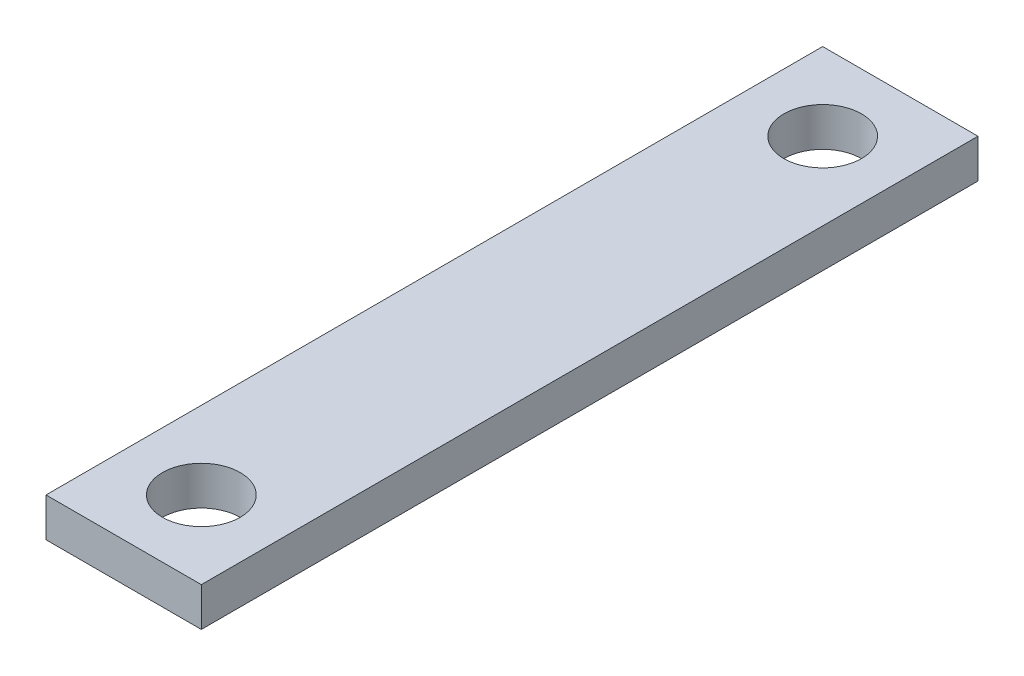
ISO-10303-21;
HEADER;
FILE_DESCRIPTION(('STEP AP214'),'2;1');
FILE_NAME('part.step','',(''),(''),'','','');
FILE_SCHEMA(('AUTOMOTIVE_DESIGN { 1 0 10303 214 1 1 1 1 }'));
ENDSEC;
DATA;
#1=APPLICATION_CONTEXT('core data for automotive mechanical design processes');
#2=APPLICATION_PROTOCOL_DEFINITION('international standard','automotive_design',2000,#1);
#3=PRODUCT_CONTEXT('',#1,'mechanical');
#4=PRODUCT('Part','Part','',(#3));
#5=PRODUCT_RELATED_PRODUCT_CATEGORY('part','',(#4));
#6=PRODUCT_DEFINITION_FORMATION('','',#4);
#7=PRODUCT_DEFINITION_CONTEXT('part definition',#1,'design');
#8=PRODUCT_DEFINITION('design','',#6,#7);
#9=PRODUCT_DEFINITION_SHAPE('','',#8);
#10=(LENGTH_UNIT() NAMED_UNIT(*) SI_UNIT(.MILLI.,.METRE.));
#11=(NAMED_UNIT(*) PLANE_ANGLE_UNIT() SI_UNIT($,.RADIAN.));
#12=(NAMED_UNIT(*) SI_UNIT($,.STERADIAN.) SOLID_ANGLE_UNIT());
#13=UNCERTAINTY_MEASURE_WITH_UNIT(LENGTH_MEASURE(1.E-05),#10,'distance_accuracy_value','');
#14=(GEOMETRIC_REPRESENTATION_CONTEXT(3) GLOBAL_UNCERTAINTY_ASSIGNED_CONTEXT((#13)) GLOBAL_UNIT_ASSIGNED_CONTEXT((#10,
#11,#12)) REPRESENTATION_CONTEXT('',''));
#15=CARTESIAN_POINT('',(0.,0.,0.));
#16=DIRECTION('',(0.,0.,1.));
#17=DIRECTION('',(1.,0.,0.));
#18=AXIS2_PLACEMENT_3D('',#15,#16,#17);
#19=CARTESIAN_POINT('',(0.,3.175,0.));
#20=DIRECTION('',(0.,-1.,0.));
#21=DIRECTION('',(0.,0.,-1.));
#22=AXIS2_PLACEMENT_3D('',#19,#20,#21);
#23=PLANE('',#22);
#24=DIRECTION('',(0.,0.,1.));
#25=VECTOR('',#24,1.);
#26=CARTESIAN_POINT('',(0.,3.175,0.));
#27=LINE('',#26,#25);
#28=CARTESIAN_POINT('',(0.,3.175,-63.5));
#29=VERTEX_POINT('',#28);
#30=CARTESIAN_POINT('',(0.,3.175,0.));
#31=VERTEX_POINT('',#30);
#32=EDGE_CURVE('E85',#29,#31,#27,.T.);
#33=ORIENTED_EDGE('',*,*,#32,.T.);
#34=DIRECTION('',(1.,0.,0.));
#35=VECTOR('',#34,1.);
#36=CARTESIAN_POINT('',(0.,3.175,0.));
#37=LINE('',#36,#35);
#38=CARTESIAN_POINT('',(12.7,3.175,0.));
#39=VERTEX_POINT('',#38);
#40=EDGE_CURVE('E80',#31,#39,#37,.T.);
#41=ORIENTED_EDGE('',*,*,#40,.T.);
#42=DIRECTION('',(0.,0.,-1.));
#43=VECTOR('',#42,1.);
#44=CARTESIAN_POINT('',(12.7,3.175,0.));
#45=LINE('',#44,#43);
#46=CARTESIAN_POINT('',(12.7,3.175,-63.5));
#47=VERTEX_POINT('',#46);
#48=EDGE_CURVE('E83',#39,#47,#45,.T.);
#49=ORIENTED_EDGE('',*,*,#48,.T.);
#50=DIRECTION('',(-1.,0.,0.));
#51=VECTOR('',#50,1.);
#52=CARTESIAN_POINT('',(0.,3.175,-63.5));
#53=LINE('',#52,#51);
#54=EDGE_CURVE('E50',#47,#29,#53,.T.);
#55=ORIENTED_EDGE('',*,*,#54,.T.);
#56=EDGE_LOOP('',(#33,#41,#49,#55));
#57=FACE_BOUND('',#56,.T.);
#58=CARTESIAN_POINT('',(6.34999999999999,3.175,-57.15));
#59=DIRECTION('',(0.,1.,0.));
#60=DIRECTION('',(0.,0.,1.));
#61=AXIS2_PLACEMENT_3D('',#58,#59,#60);
#62=CIRCLE('',#61,3.175);
#63=CARTESIAN_POINT('',(6.34999999999999,3.175,-53.975));
#64=VERTEX_POINT('',#63);
#65=EDGE_CURVE('E100',#64,#64,#62,.T.);
#66=ORIENTED_EDGE('',*,*,#65,.F.);
#67=EDGE_LOOP('',(#66));
#68=FACE_BOUND('',#67,.T.);
#69=CARTESIAN_POINT('',(6.35,3.175,-6.35));
#70=DIRECTION('',(0.,1.,0.));
#71=DIRECTION('',(0.,0.,1.));
#72=AXIS2_PLACEMENT_3D('',#69,#70,#71);
#73=CIRCLE('',#72,3.175);
#74=CARTESIAN_POINT('',(6.35,3.175,-3.175));
#75=VERTEX_POINT('',#74);
#76=EDGE_CURVE('E115',#75,#75,#73,.T.);
#77=ORIENTED_EDGE('',*,*,#76,.F.);
#78=EDGE_LOOP('',(#77));
#79=FACE_BOUND('',#78,.T.);
#80=ADVANCED_FACE('F33',(#57,#68,#79),#23,.F.);
#81=CARTESIAN_POINT('',(0.,0.,0.));
#82=DIRECTION('',(0.,-1.,0.));
#83=DIRECTION('',(0.,0.,-1.));
#84=AXIS2_PLACEMENT_3D('',#81,#82,#83);
#85=PLANE('',#84);
#86=CARTESIAN_POINT('',(6.34999999999999,0.,-57.15));
#87=DIRECTION('',(0.,1.,0.));
#88=DIRECTION('',(0.,0.,1.));
#89=AXIS2_PLACEMENT_3D('',#86,#87,#88);
#90=CIRCLE('',#89,3.175);
#91=CARTESIAN_POINT('',(6.34999999999999,0.,-53.975));
#92=VERTEX_POINT('',#91);
#93=EDGE_CURVE('E112',#92,#92,#90,.T.);
#94=ORIENTED_EDGE('',*,*,#93,.T.);
#95=EDGE_LOOP('',(#94));
#96=FACE_BOUND('',#95,.T.);
#97=DIRECTION('',(0.,0.,1.));
#98=VECTOR('',#97,1.);
#99=CARTESIAN_POINT('',(0.,0.,0.));
#100=LINE('',#99,#98);
#101=CARTESIAN_POINT('',(0.,0.,-63.5));
#102=VERTEX_POINT('',#101);
#103=CARTESIAN_POINT('',(0.,0.,0.));
#104=VERTEX_POINT('',#103);
#105=EDGE_CURVE('E97',#102,#104,#100,.T.);
#106=ORIENTED_EDGE('',*,*,#105,.F.);
#107=DIRECTION('',(-1.,0.,0.));
#108=VECTOR('',#107,1.);
#109=CARTESIAN_POINT('',(0.,0.,-63.5));
#110=LINE('',#109,#108);
#111=CARTESIAN_POINT('',(12.7,0.,-63.5));
#112=VERTEX_POINT('',#111);
#113=EDGE_CURVE('E73',#112,#102,#110,.T.);
#114=ORIENTED_EDGE('',*,*,#113,.F.);
#115=DIRECTION('',(0.,0.,-1.));
#116=VECTOR('',#115,1.);
#117=CARTESIAN_POINT('',(12.7,0.,0.));
#118=LINE('',#117,#116);
#119=CARTESIAN_POINT('',(12.7,0.,0.));
#120=VERTEX_POINT('',#119);
#121=EDGE_CURVE('E67',#120,#112,#118,.T.);
#122=ORIENTED_EDGE('',*,*,#121,.F.);
#123=DIRECTION('',(1.,0.,0.));
#124=VECTOR('',#123,1.);
#125=CARTESIAN_POINT('',(0.,0.,0.));
#126=LINE('',#125,#124);
#127=EDGE_CURVE('E89',#104,#120,#126,.T.);
#128=ORIENTED_EDGE('',*,*,#127,.F.);
#129=EDGE_LOOP('',(#106,#114,#122,#128));
#130=FACE_BOUND('',#129,.T.);
#131=CARTESIAN_POINT('',(6.35,0.,-6.35));
#132=DIRECTION('',(0.,1.,0.));
#133=DIRECTION('',(0.,0.,1.));
#134=AXIS2_PLACEMENT_3D('',#131,#132,#133);
#135=CIRCLE('',#134,3.175);
#136=CARTESIAN_POINT('',(6.35,0.,-3.175));
#137=VERTEX_POINT('',#136);
#138=EDGE_CURVE('E118',#137,#137,#135,.T.);
#139=ORIENTED_EDGE('',*,*,#138,.T.);
#140=EDGE_LOOP('',(#139));
#141=FACE_BOUND('',#140,.T.);
#142=ADVANCED_FACE('F108',(#96,#130,#141),#85,.T.);
#143=CARTESIAN_POINT('',(0.,3.175,0.));
#144=DIRECTION('',(1.,0.,0.));
#145=DIRECTION('',(0.,0.,-1.));
#146=AXIS2_PLACEMENT_3D('',#143,#144,#145);
#147=PLANE('',#146);
#148=ORIENTED_EDGE('',*,*,#105,.T.);
#149=DIRECTION('',(0.,-1.,0.));
#150=VECTOR('',#149,1.);
#151=CARTESIAN_POINT('',(0.,3.175,0.));
#152=LINE('',#151,#150);
#153=EDGE_CURVE('E11',#31,#104,#152,.T.);
#154=ORIENTED_EDGE('',*,*,#153,.F.);
#155=ORIENTED_EDGE('',*,*,#32,.F.);
#156=DIRECTION('',(0.,-1.,0.));
#157=VECTOR('',#156,1.);
#158=CARTESIAN_POINT('',(0.,3.175,-63.5));
#159=LINE('',#158,#157);
#160=EDGE_CURVE('E93',#29,#102,#159,.T.);
#161=ORIENTED_EDGE('',*,*,#160,.T.);
#162=EDGE_LOOP('',(#148,#154,#155,#161));
#163=FACE_BOUND('',#162,.T.);
#164=ADVANCED_FACE('F35',(#163),#147,.F.);
#165=CARTESIAN_POINT('',(0.,3.175,0.));
#166=DIRECTION('',(0.,0.,-1.));
#167=DIRECTION('',(-1.,0.,0.));
#168=AXIS2_PLACEMENT_3D('',#165,#166,#167);
#169=PLANE('',#168);
#170=ORIENTED_EDGE('',*,*,#127,.T.);
#171=DIRECTION('',(0.,-1.,0.));
#172=VECTOR('',#171,1.);
#173=CARTESIAN_POINT('',(12.7,3.175,0.));
#174=LINE('',#173,#172);
#175=EDGE_CURVE('E42',#39,#120,#174,.T.);
#176=ORIENTED_EDGE('',*,*,#175,.F.);
#177=ORIENTED_EDGE('',*,*,#40,.F.);
#178=ORIENTED_EDGE('',*,*,#153,.T.);
#179=EDGE_LOOP('',(#170,#176,#177,#178));
#180=FACE_BOUND('',#179,.T.);
#181=ADVANCED_FACE('F88',(#180),#169,.F.);
#182=CARTESIAN_POINT('',(12.7,3.175,0.));
#183=DIRECTION('',(-1.,0.,0.));
#184=DIRECTION('',(0.,0.,1.));
#185=AXIS2_PLACEMENT_3D('',#182,#183,#184);
#186=PLANE('',#185);
#187=ORIENTED_EDGE('',*,*,#121,.T.);
#188=DIRECTION('',(0.,-1.,0.));
#189=VECTOR('',#188,1.);
#190=CARTESIAN_POINT('',(12.7,3.175,-63.5));
#191=LINE('',#190,#189);
#192=EDGE_CURVE('E90',#47,#112,#191,.T.);
#193=ORIENTED_EDGE('',*,*,#192,.F.);
#194=ORIENTED_EDGE('',*,*,#48,.F.);
#195=ORIENTED_EDGE('',*,*,#175,.T.);
#196=EDGE_LOOP('',(#187,#193,#194,#195));
#197=FACE_BOUND('',#196,.T.);
#198=ADVANCED_FACE('F91',(#197),#186,.F.);
#199=CARTESIAN_POINT('',(0.,3.175,-63.5));
#200=DIRECTION('',(0.,0.,1.));
#201=DIRECTION('',(1.,0.,0.));
#202=AXIS2_PLACEMENT_3D('',#199,#200,#201);
#203=PLANE('',#202);
#204=ORIENTED_EDGE('',*,*,#113,.T.);
#205=ORIENTED_EDGE('',*,*,#160,.F.);
#206=ORIENTED_EDGE('',*,*,#54,.F.);
#207=ORIENTED_EDGE('',*,*,#192,.T.);
#208=EDGE_LOOP('',(#204,#205,#206,#207));
#209=FACE_BOUND('',#208,.T.);
#210=ADVANCED_FACE('F105',(#209),#203,.F.);
#211=CARTESIAN_POINT('',(6.34999999999999,3.175,-57.15));
#212=DIRECTION('',(0.,-1.,0.));
#213=DIRECTION('',(0.,0.,-1.));
#214=AXIS2_PLACEMENT_3D('',#211,#212,#213);
#215=CYLINDRICAL_SURFACE('',#214,3.175);
#216=ORIENTED_EDGE('',*,*,#65,.T.);
#217=EDGE_LOOP('',(#216));
#218=FACE_BOUND('',#217,.T.);
#219=ORIENTED_EDGE('',*,*,#93,.F.);
#220=EDGE_LOOP('',(#219));
#221=FACE_BOUND('',#220,.T.);
#222=ADVANCED_FACE('F135',(#218,#221),#215,.F.);
#223=CARTESIAN_POINT('',(6.35,3.175,-6.35));
#224=DIRECTION('',(0.,-1.,0.));
#225=DIRECTION('',(0.,0.,-1.));
#226=AXIS2_PLACEMENT_3D('',#223,#224,#225);
#227=CYLINDRICAL_SURFACE('',#226,3.175);
#228=ORIENTED_EDGE('',*,*,#76,.T.);
#229=EDGE_LOOP('',(#228));
#230=FACE_BOUND('',#229,.T.);
#231=ORIENTED_EDGE('',*,*,#138,.F.);
#232=EDGE_LOOP('',(#231));
#233=FACE_BOUND('',#232,.T.);
#234=ADVANCED_FACE('F124',(#230,#233),#227,.F.);
#235=CLOSED_SHELL('',(#80,#142,#164,#181,#198,#210,#222,#234));
#236=MANIFOLD_SOLID_BREP('B2',#235);
#237=ADVANCED_BREP_SHAPE_REPRESENTATION('',(#18,#236),#14);
#238=SHAPE_DEFINITION_REPRESENTATION(#9,#237);
ENDSEC;
END-ISO-10303-21;
